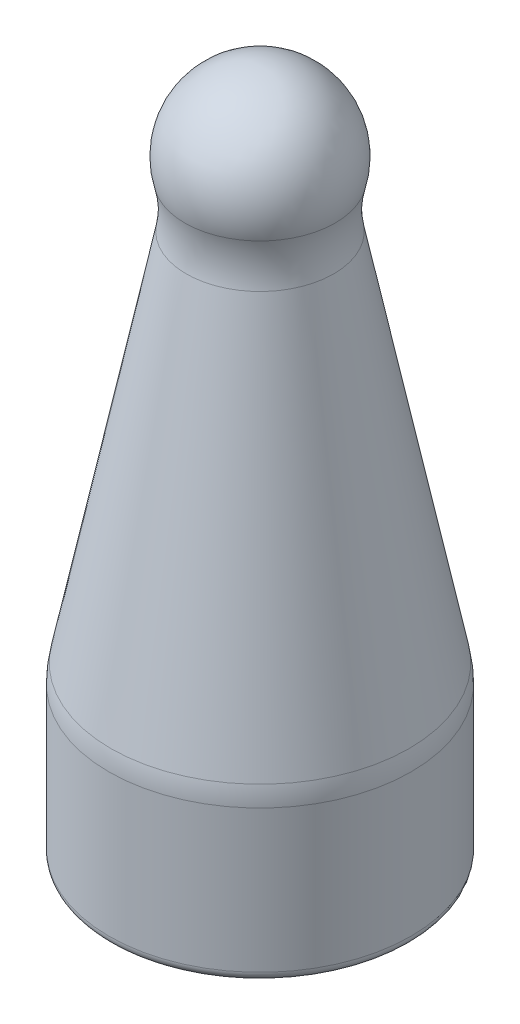
ISO-10303-21;
HEADER;
FILE_DESCRIPTION(('STEP AP214'),'2;1');
FILE_NAME('part.step','',(''),(''),'','','');
FILE_SCHEMA(('AUTOMOTIVE_DESIGN { 1 0 10303 214 1 1 1 1 }'));
ENDSEC;
DATA;
#1=APPLICATION_CONTEXT('core data for automotive mechanical design processes');
#2=APPLICATION_PROTOCOL_DEFINITION('international standard','automotive_design',2000,#1);
#3=PRODUCT_CONTEXT('',#1,'mechanical');
#4=PRODUCT('Part','Part','',(#3));
#5=PRODUCT_RELATED_PRODUCT_CATEGORY('part','',(#4));
#6=PRODUCT_DEFINITION_FORMATION('','',#4);
#7=PRODUCT_DEFINITION_CONTEXT('part definition',#1,'design');
#8=PRODUCT_DEFINITION('design','',#6,#7);
#9=PRODUCT_DEFINITION_SHAPE('','',#8);
#10=(LENGTH_UNIT() NAMED_UNIT(*) SI_UNIT(.MILLI.,.METRE.));
#11=(NAMED_UNIT(*) PLANE_ANGLE_UNIT() SI_UNIT($,.RADIAN.));
#12=(NAMED_UNIT(*) SI_UNIT($,.STERADIAN.) SOLID_ANGLE_UNIT());
#13=UNCERTAINTY_MEASURE_WITH_UNIT(LENGTH_MEASURE(1.E-05),#10,'distance_accuracy_value','');
#14=(GEOMETRIC_REPRESENTATION_CONTEXT(3) GLOBAL_UNCERTAINTY_ASSIGNED_CONTEXT((#13)) GLOBAL_UNIT_ASSIGNED_CONTEXT((#10,
#11,#12)) REPRESENTATION_CONTEXT('',''));
#15=CARTESIAN_POINT('',(0.,0.,0.));
#16=DIRECTION('',(0.,0.,1.));
#17=DIRECTION('',(1.,0.,0.));
#18=AXIS2_PLACEMENT_3D('',#15,#16,#17);
#19=CARTESIAN_POINT('',(0.,37.8000000000003,0.));
#20=DIRECTION('',(0.,-1.,0.));
#21=DIRECTION('',(1.,0.,0.));
#22=AXIS2_PLACEMENT_3D('',#19,#20,#21);
#23=PLANE('',#22);
#24=CARTESIAN_POINT('',(0.,37.8000000000003,0.));
#25=DIRECTION('',(0.,1.,0.));
#26=DIRECTION('',(-1.,0.,0.));
#27=AXIS2_PLACEMENT_3D('',#24,#25,#26);
#28=CIRCLE('',#27,12.5);
#29=CARTESIAN_POINT('',(-12.5,37.8000000000003,0.));
#30=VERTEX_POINT('',#29);
#31=EDGE_CURVE('E82',#30,#30,#28,.T.);
#32=ORIENTED_EDGE('',*,*,#31,.F.);
#33=EDGE_LOOP('',(#32));
#34=FACE_BOUND('',#33,.T.);
#35=ADVANCED_FACE('F35',(#34),#23,.T.);
#36=CARTESIAN_POINT('',(0.,87.8,0.));
#37=DIRECTION('',(0.,1.,0.));
#38=DIRECTION('',(1.,0.,0.));
#39=AXIS2_PLACEMENT_3D('',#36,#37,#38);
#40=SPHERICAL_SURFACE('',#39,8.);
#41=CARTESIAN_POINT('',(0.,85.7043765452389,0.));
#42=DIRECTION('',(0.,1.,0.));
#43=DIRECTION('',(-1.,0.,0.));
#44=AXIS2_PLACEMENT_3D('',#41,#42,#43);
#45=CIRCLE('',#44,7.72064520204466);
#46=CARTESIAN_POINT('',(-7.72064520204466,85.7043765452389,0.));
#47=VERTEX_POINT('',#46);
#48=EDGE_CURVE('E46',#47,#47,#45,.T.);
#49=ORIENTED_EDGE('',*,*,#48,.T.);
#50=EDGE_LOOP('',(#49));
#51=FACE_BOUND('',#50,.T.);
#52=ADVANCED_FACE('F90',(#51),#40,.T.);
#53=CARTESIAN_POINT('',(0.,83.9270166537926,0.));
#54=DIRECTION('',(0.,-1.,0.));
#55=DIRECTION('',(1.,0.,0.));
#56=AXIS2_PLACEMENT_3D('',#53,#54,#55);
#57=CONICAL_SURFACE('',#56,7.,0.199097628639876);
#58=CARTESIAN_POINT('',(0.,42.7790590112164,0.));
#59=DIRECTION('',(0.,1.,0.));
#60=DIRECTION('',(-1.,0.,0.));
#61=AXIS2_PLACEMENT_3D('',#58,#59,#60);
#62=CIRCLE('',#61,15.3024545230978);
#63=CARTESIAN_POINT('',(-15.3024545230978,42.7790590112164,0.));
#64=VERTEX_POINT('',#63);
#65=EDGE_CURVE('E55',#64,#64,#62,.T.);
#66=ORIENTED_EDGE('',*,*,#65,.T.);
#67=EDGE_LOOP('',(#66));
#68=FACE_BOUND('',#67,.T.);
#69=CARTESIAN_POINT('',(0.,81.1069985666017,0.));
#70=DIRECTION('',(0.,-1.,0.));
#71=DIRECTION('',(1.,0.,0.));
#72=AXIS2_PLACEMENT_3D('',#69,#70,#71);
#73=CIRCLE('',#72,7.56899718150265);
#74=CARTESIAN_POINT('',(7.56899718150265,81.1069985666017,0.));
#75=VERTEX_POINT('',#74);
#76=EDGE_CURVE('E58',#75,#75,#73,.T.);
#77=ORIENTED_EDGE('',*,*,#76,.T.);
#78=EDGE_LOOP('',(#77));
#79=FACE_BOUND('',#78,.T.);
#80=ADVANCED_FACE('F95',(#68,#79),#57,.T.);
#81=CARTESIAN_POINT('',(0.,95.8,0.));
#82=DIRECTION('',(0.,1.,0.));
#83=DIRECTION('',(-1.,0.,0.));
#84=AXIS2_PLACEMENT_3D('',#81,#82,#83);
#85=CYLINDRICAL_SURFACE('',#84,15.5);
#86=CARTESIAN_POINT('',(0.,26.1999999999997,0.));
#87=DIRECTION('',(0.,-1.,0.));
#88=DIRECTION('',(1.,0.,0.));
#89=AXIS2_PLACEMENT_3D('',#86,#87,#88);
#90=CIRCLE('',#89,15.5);
#91=CARTESIAN_POINT('',(15.5,26.1999999999997,0.));
#92=VERTEX_POINT('',#91);
#93=EDGE_CURVE('E42',#92,#92,#90,.F.);
#94=ORIENTED_EDGE('',*,*,#93,.T.);
#95=EDGE_LOOP('',(#94));
#96=FACE_BOUND('',#95,.T.);
#97=CARTESIAN_POINT('',(0.,40.8012103510305,0.));
#98=DIRECTION('',(0.,-1.,0.));
#99=DIRECTION('',(1.,0.,0.));
#100=AXIS2_PLACEMENT_3D('',#97,#98,#99);
#101=CIRCLE('',#100,15.5);
#102=CARTESIAN_POINT('',(15.5,40.8012103510305,0.));
#103=VERTEX_POINT('',#102);
#104=EDGE_CURVE('E50',#103,#103,#101,.T.);
#105=ORIENTED_EDGE('',*,*,#104,.T.);
#106=EDGE_LOOP('',(#105));
#107=FACE_BOUND('',#106,.T.);
#108=ADVANCED_FACE('F115',(#96,#107),#85,.T.);
#109=CARTESIAN_POINT('',(-12.5,25.1999999999997,0.));
#110=DIRECTION('',(0.,-1.,0.));
#111=DIRECTION('',(1.,0.,0.));
#112=AXIS2_PLACEMENT_3D('',#109,#110,#111);
#113=PLANE('',#112);
#114=CARTESIAN_POINT('',(0.,25.1999999999997,0.));
#115=DIRECTION('',(0.,-1.,0.));
#116=DIRECTION('',(1.,0.,0.));
#117=AXIS2_PLACEMENT_3D('',#114,#115,#116);
#118=CIRCLE('',#117,14.5);
#119=CARTESIAN_POINT('',(14.5,25.1999999999997,0.));
#120=VERTEX_POINT('',#119);
#121=EDGE_CURVE('E10',#120,#120,#118,.T.);
#122=ORIENTED_EDGE('',*,*,#121,.T.);
#123=EDGE_LOOP('',(#122));
#124=FACE_BOUND('',#123,.T.);
#125=CARTESIAN_POINT('',(0.,25.1999999999997,0.));
#126=DIRECTION('',(0.,1.,0.));
#127=DIRECTION('',(-1.,0.,0.));
#128=AXIS2_PLACEMENT_3D('',#125,#126,#127);
#129=CIRCLE('',#128,9.50000000000001);
#130=CARTESIAN_POINT('',(-9.50000000000001,25.1999999999997,0.));
#131=VERTEX_POINT('',#130);
#132=EDGE_CURVE('E61',#131,#131,#129,.T.);
#133=ORIENTED_EDGE('',*,*,#132,.T.);
#134=EDGE_LOOP('',(#133));
#135=FACE_BOUND('',#134,.T.);
#136=ADVANCED_FACE('F120',(#124,#135),#113,.T.);
#137=CARTESIAN_POINT('',(0.,95.8,0.));
#138=DIRECTION('',(0.,1.,0.));
#139=DIRECTION('',(-1.,0.,0.));
#140=AXIS2_PLACEMENT_3D('',#137,#138,#139);
#141=CYLINDRICAL_SURFACE('',#140,9.50000000000001);
#142=CARTESIAN_POINT('',(0.,28.1999999999997,0.));
#143=DIRECTION('',(0.,1.,0.));
#144=DIRECTION('',(-1.,0.,0.));
#145=AXIS2_PLACEMENT_3D('',#142,#143,#144);
#146=CIRCLE('',#145,9.50000000000001);
#147=CARTESIAN_POINT('',(-9.50000000000001,28.1999999999997,0.));
#148=VERTEX_POINT('',#147);
#149=EDGE_CURVE('E64',#148,#148,#146,.T.);
#150=ORIENTED_EDGE('',*,*,#149,.T.);
#151=EDGE_LOOP('',(#150));
#152=FACE_BOUND('',#151,.T.);
#153=ORIENTED_EDGE('',*,*,#132,.F.);
#154=EDGE_LOOP('',(#153));
#155=FACE_BOUND('',#154,.T.);
#156=ADVANCED_FACE('F125',(#152,#155),#141,.F.);
#157=CARTESIAN_POINT('',(-12.5,28.1999999999997,0.));
#158=DIRECTION('',(0.,1.,0.));
#159=DIRECTION('',(-1.,0.,0.));
#160=AXIS2_PLACEMENT_3D('',#157,#158,#159);
#161=PLANE('',#160);
#162=CARTESIAN_POINT('',(0.,28.1999999999997,0.));
#163=DIRECTION('',(0.,1.,0.));
#164=DIRECTION('',(-1.,0.,0.));
#165=AXIS2_PLACEMENT_3D('',#162,#163,#164);
#166=CIRCLE('',#165,12.5);
#167=CARTESIAN_POINT('',(-12.5,28.1999999999997,0.));
#168=VERTEX_POINT('',#167);
#169=EDGE_CURVE('E67',#168,#168,#166,.T.);
#170=ORIENTED_EDGE('',*,*,#169,.T.);
#171=EDGE_LOOP('',(#170));
#172=FACE_BOUND('',#171,.T.);
#173=ORIENTED_EDGE('',*,*,#149,.F.);
#174=EDGE_LOOP('',(#173));
#175=FACE_BOUND('',#174,.T.);
#176=ADVANCED_FACE('F128',(#172,#175),#161,.T.);
#177=CARTESIAN_POINT('',(0.,95.8,0.));
#178=DIRECTION('',(0.,1.,0.));
#179=DIRECTION('',(-1.,0.,0.));
#180=AXIS2_PLACEMENT_3D('',#177,#178,#179);
#181=CYLINDRICAL_SURFACE('',#180,12.5);
#182=CARTESIAN_POINT('',(0.,31.5,0.));
#183=DIRECTION('',(0.,1.,0.));
#184=DIRECTION('',(-1.,0.,0.));
#185=AXIS2_PLACEMENT_3D('',#182,#183,#184);
#186=CIRCLE('',#185,12.5);
#187=CARTESIAN_POINT('',(-12.5,31.5,0.));
#188=VERTEX_POINT('',#187);
#189=EDGE_CURVE('E70',#188,#188,#186,.T.);
#190=ORIENTED_EDGE('',*,*,#189,.T.);
#191=EDGE_LOOP('',(#190));
#192=FACE_BOUND('',#191,.T.);
#193=ORIENTED_EDGE('',*,*,#169,.F.);
#194=EDGE_LOOP('',(#193));
#195=FACE_BOUND('',#194,.T.);
#196=ADVANCED_FACE('F132',(#192,#195),#181,.F.);
#197=CARTESIAN_POINT('',(-12.5,31.5,0.));
#198=DIRECTION('',(0.,-1.,0.));
#199=DIRECTION('',(1.,0.,0.));
#200=AXIS2_PLACEMENT_3D('',#197,#198,#199);
#201=PLANE('',#200);
#202=CARTESIAN_POINT('',(0.,31.5,0.));
#203=DIRECTION('',(0.,1.,0.));
#204=DIRECTION('',(-1.,0.,0.));
#205=AXIS2_PLACEMENT_3D('',#202,#203,#204);
#206=CIRCLE('',#205,9.50000000000001);
#207=CARTESIAN_POINT('',(-9.50000000000001,31.5,0.));
#208=VERTEX_POINT('',#207);
#209=EDGE_CURVE('E73',#208,#208,#206,.T.);
#210=ORIENTED_EDGE('',*,*,#209,.T.);
#211=EDGE_LOOP('',(#210));
#212=FACE_BOUND('',#211,.T.);
#213=ORIENTED_EDGE('',*,*,#189,.F.);
#214=EDGE_LOOP('',(#213));
#215=FACE_BOUND('',#214,.T.);
#216=ADVANCED_FACE('F136',(#212,#215),#201,.T.);
#217=CARTESIAN_POINT('',(0.,95.8,0.));
#218=DIRECTION('',(0.,1.,0.));
#219=DIRECTION('',(-1.,0.,0.));
#220=AXIS2_PLACEMENT_3D('',#217,#218,#219);
#221=CYLINDRICAL_SURFACE('',#220,9.50000000000001);
#222=CARTESIAN_POINT('',(0.,34.5,0.));
#223=DIRECTION('',(0.,1.,0.));
#224=DIRECTION('',(-1.,0.,0.));
#225=AXIS2_PLACEMENT_3D('',#222,#223,#224);
#226=CIRCLE('',#225,9.50000000000001);
#227=CARTESIAN_POINT('',(-9.50000000000001,34.5,0.));
#228=VERTEX_POINT('',#227);
#229=EDGE_CURVE('E76',#228,#228,#226,.T.);
#230=ORIENTED_EDGE('',*,*,#229,.T.);
#231=EDGE_LOOP('',(#230));
#232=FACE_BOUND('',#231,.T.);
#233=ORIENTED_EDGE('',*,*,#209,.F.);
#234=EDGE_LOOP('',(#233));
#235=FACE_BOUND('',#234,.T.);
#236=ADVANCED_FACE('F140',(#232,#235),#221,.F.);
#237=CARTESIAN_POINT('',(-9.50000000000001,34.5,0.));
#238=DIRECTION('',(0.,1.,0.));
#239=DIRECTION('',(-1.,0.,0.));
#240=AXIS2_PLACEMENT_3D('',#237,#238,#239);
#241=PLANE('',#240);
#242=CARTESIAN_POINT('',(0.,34.5,0.));
#243=DIRECTION('',(0.,1.,0.));
#244=DIRECTION('',(-1.,0.,0.));
#245=AXIS2_PLACEMENT_3D('',#242,#243,#244);
#246=CIRCLE('',#245,12.5);
#247=CARTESIAN_POINT('',(-12.5,34.5,0.));
#248=VERTEX_POINT('',#247);
#249=EDGE_CURVE('E79',#248,#248,#246,.T.);
#250=ORIENTED_EDGE('',*,*,#249,.T.);
#251=EDGE_LOOP('',(#250));
#252=FACE_BOUND('',#251,.T.);
#253=ORIENTED_EDGE('',*,*,#229,.F.);
#254=EDGE_LOOP('',(#253));
#255=FACE_BOUND('',#254,.T.);
#256=ADVANCED_FACE('F144',(#252,#255),#241,.T.);
#257=CARTESIAN_POINT('',(0.,95.8,0.));
#258=DIRECTION('',(0.,1.,0.));
#259=DIRECTION('',(-1.,0.,0.));
#260=AXIS2_PLACEMENT_3D('',#257,#258,#259);
#261=CYLINDRICAL_SURFACE('',#260,12.5);
#262=ORIENTED_EDGE('',*,*,#31,.T.);
#263=EDGE_LOOP('',(#262));
#264=FACE_BOUND('',#263,.T.);
#265=ORIENTED_EDGE('',*,*,#249,.F.);
#266=EDGE_LOOP('',(#265));
#267=FACE_BOUND('',#266,.T.);
#268=ADVANCED_FACE('F86',(#264,#267),#261,.F.);
#269=CARTESIAN_POINT('',(0.,40.8012103510305,0.));
#270=DIRECTION('',(0.,-1.,0.));
#271=DIRECTION('',(1.,0.,0.));
#272=AXIS2_PLACEMENT_3D('',#269,#270,#271);
#273=DEGENERATE_TOROIDAL_SURFACE('',#272,5.50000000000001,10.,.T.);
#274=ORIENTED_EDGE('',*,*,#104,.F.);
#275=EDGE_LOOP('',(#274));
#276=FACE_BOUND('',#275,.T.);
#277=ORIENTED_EDGE('',*,*,#65,.F.);
#278=EDGE_LOOP('',(#277));
#279=FACE_BOUND('',#278,.T.);
#280=ADVANCED_FACE('F100',(#276,#279),#273,.T.);
#281=CARTESIAN_POINT('',(0.,83.0848472267875,0.));
#282=DIRECTION('',(0.,1.,0.));
#283=DIRECTION('',(-1.,0.,0.));
#284=AXIS2_PLACEMENT_3D('',#281,#282,#283);
#285=TOROIDAL_SURFACE('',#284,17.3714517046005,10.);
#286=ORIENTED_EDGE('',*,*,#76,.F.);
#287=EDGE_LOOP('',(#286));
#288=FACE_BOUND('',#287,.T.);
#289=ORIENTED_EDGE('',*,*,#48,.F.);
#290=EDGE_LOOP('',(#289));
#291=FACE_BOUND('',#290,.T.);
#292=ADVANCED_FACE('F102',(#288,#291),#285,.F.);
#293=CARTESIAN_POINT('',(0.,26.1999999999997,0.));
#294=DIRECTION('',(0.,-1.,0.));
#295=DIRECTION('',(1.,0.,0.));
#296=AXIS2_PLACEMENT_3D('',#293,#294,#295);
#297=TOROIDAL_SURFACE('',#296,14.5,1.);
#298=ORIENTED_EDGE('',*,*,#121,.F.);
#299=EDGE_LOOP('',(#298));
#300=FACE_BOUND('',#299,.T.);
#301=ORIENTED_EDGE('',*,*,#93,.F.);
#302=EDGE_LOOP('',(#301));
#303=FACE_BOUND('',#302,.T.);
#304=ADVANCED_FACE('F37',(#300,#303),#297,.T.);
#305=CLOSED_SHELL('',(#35,#52,#80,#108,#136,#156,#176,#196,#216,#236,#256,#268,#280,#292,#304));
#306=MANIFOLD_SOLID_BREP('B2',#305);
#307=ADVANCED_BREP_SHAPE_REPRESENTATION('',(#18,#306),#14);
#308=SHAPE_DEFINITION_REPRESENTATION(#9,#307);
ENDSEC;
END-ISO-10303-21;
